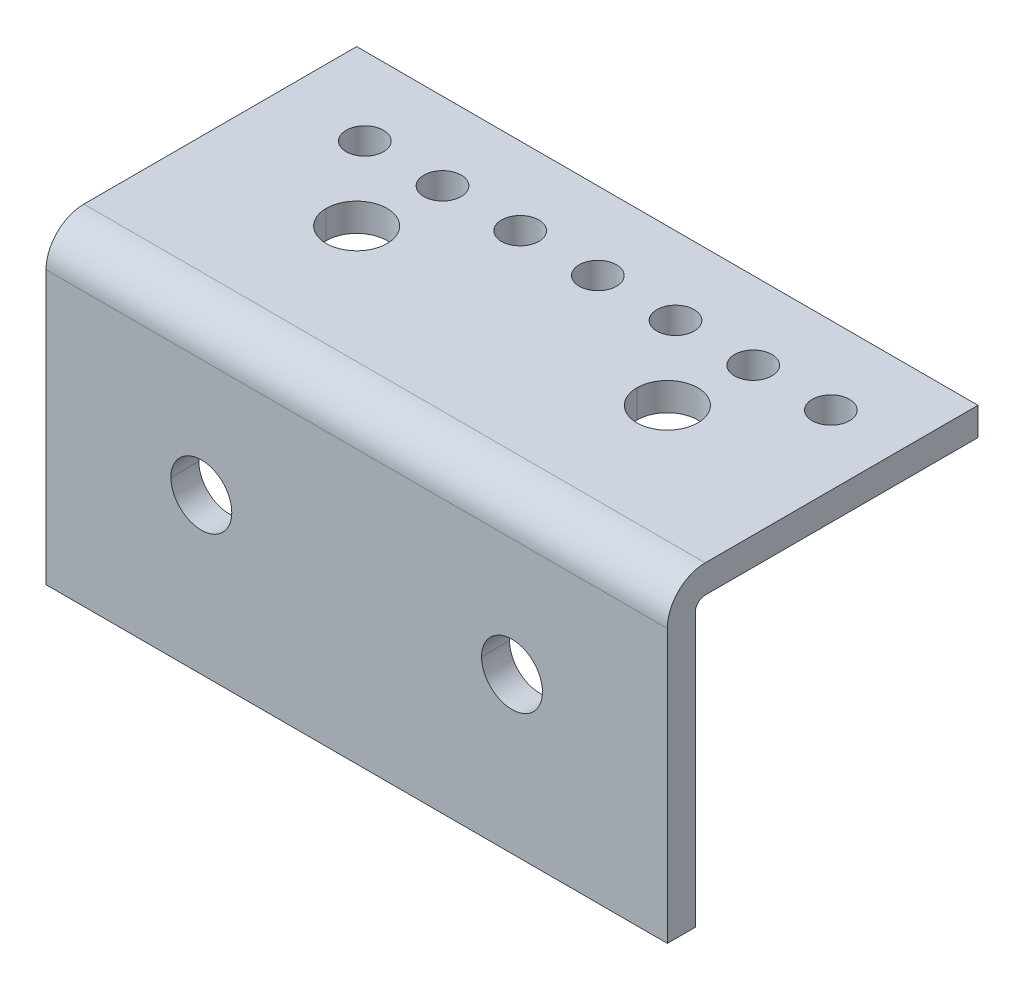
ISO-10303-21;
HEADER;
FILE_DESCRIPTION(('STEP AP214'),'2;1');
FILE_NAME('part.step','',(''),(''),'','','');
FILE_SCHEMA(('AUTOMOTIVE_DESIGN { 1 0 10303 214 1 1 1 1 }'));
ENDSEC;
DATA;
#1=APPLICATION_CONTEXT('core data for automotive mechanical design processes');
#2=APPLICATION_PROTOCOL_DEFINITION('international standard','automotive_design',2000,#1);
#3=PRODUCT_CONTEXT('',#1,'mechanical');
#4=PRODUCT('Part','Part','',(#3));
#5=PRODUCT_RELATED_PRODUCT_CATEGORY('part','',(#4));
#6=PRODUCT_DEFINITION_FORMATION('','',#4);
#7=PRODUCT_DEFINITION_CONTEXT('part definition',#1,'design');
#8=PRODUCT_DEFINITION('design','',#6,#7);
#9=PRODUCT_DEFINITION_SHAPE('','',#8);
#10=(LENGTH_UNIT() NAMED_UNIT(*) SI_UNIT(.MILLI.,.METRE.));
#11=(NAMED_UNIT(*) PLANE_ANGLE_UNIT() SI_UNIT($,.RADIAN.));
#12=(NAMED_UNIT(*) SI_UNIT($,.STERADIAN.) SOLID_ANGLE_UNIT());
#13=UNCERTAINTY_MEASURE_WITH_UNIT(LENGTH_MEASURE(1.E-05),#10,'distance_accuracy_value','');
#14=(GEOMETRIC_REPRESENTATION_CONTEXT(3) GLOBAL_UNCERTAINTY_ASSIGNED_CONTEXT((#13)) GLOBAL_UNIT_ASSIGNED_CONTEXT((#10,
#11,#12)) REPRESENTATION_CONTEXT('',''));
#15=CARTESIAN_POINT('',(0.,0.,0.));
#16=DIRECTION('',(0.,0.,1.));
#17=DIRECTION('',(1.,0.,0.));
#18=AXIS2_PLACEMENT_3D('',#15,#16,#17);
#19=CARTESIAN_POINT('',(-38.1,-25.4,25.4));
#20=DIRECTION('',(0.,0.,-1.));
#21=DIRECTION('',(1.,0.,0.));
#22=AXIS2_PLACEMENT_3D('',#19,#20,#21);
#23=CYLINDRICAL_SURFACE('',#22,2.4892);
#24=DIRECTION('',(0.,0.,-1.));
#25=VECTOR('',#24,1.);
#26=CARTESIAN_POINT('',(-40.5892,-25.4,25.4));
#27=LINE('',#26,#25);
#28=CARTESIAN_POINT('',(-40.5892,-25.4,25.4));
#29=VERTEX_POINT('',#28);
#30=CARTESIAN_POINT('',(-40.5892,-25.4,23.114));
#31=VERTEX_POINT('',#30);
#32=EDGE_CURVE('E157',#29,#31,#27,.T.);
#33=ORIENTED_EDGE('',*,*,#32,.F.);
#34=CARTESIAN_POINT('',(-38.1,-25.4,25.4));
#35=DIRECTION('',(0.,0.,-1.));
#36=DIRECTION('',(1.,0.,0.));
#37=AXIS2_PLACEMENT_3D('',#34,#35,#36);
#38=CIRCLE('',#37,2.4892);
#39=CARTESIAN_POINT('',(-35.6108,-25.4,25.4));
#40=VERTEX_POINT('',#39);
#41=EDGE_CURVE('E142',#40,#29,#38,.T.);
#42=ORIENTED_EDGE('',*,*,#41,.F.);
#43=DIRECTION('',(0.,0.,-1.));
#44=VECTOR('',#43,1.);
#45=CARTESIAN_POINT('',(-35.6108,-25.4,25.4));
#46=LINE('',#45,#44);
#47=CARTESIAN_POINT('',(-35.6108,-25.4,23.114));
#48=VERTEX_POINT('',#47);
#49=EDGE_CURVE('E165',#40,#48,#46,.T.);
#50=ORIENTED_EDGE('',*,*,#49,.T.);
#51=CARTESIAN_POINT('',(-38.1,-25.4,23.114));
#52=DIRECTION('',(0.,0.,-1.));
#53=DIRECTION('',(1.,0.,0.));
#54=AXIS2_PLACEMENT_3D('',#51,#52,#53);
#55=CIRCLE('',#54,2.4892);
#56=EDGE_CURVE('E55',#48,#31,#55,.T.);
#57=ORIENTED_EDGE('',*,*,#56,.T.);
#58=EDGE_LOOP('',(#33,#42,#50,#57));
#59=FACE_BOUND('',#58,.T.);
#60=ADVANCED_FACE('F44',(#59),#23,.F.);
#61=CARTESIAN_POINT('',(-12.7,-25.4,25.4));
#62=DIRECTION('',(0.,0.,-1.));
#63=DIRECTION('',(1.,0.,0.));
#64=AXIS2_PLACEMENT_3D('',#61,#62,#63);
#65=CYLINDRICAL_SURFACE('',#64,2.4892);
#66=DIRECTION('',(0.,0.,-1.));
#67=VECTOR('',#66,1.);
#68=CARTESIAN_POINT('',(-15.1892,-25.4,25.4));
#69=LINE('',#68,#67);
#70=CARTESIAN_POINT('',(-15.1892,-25.4,25.4));
#71=VERTEX_POINT('',#70);
#72=CARTESIAN_POINT('',(-15.1892,-25.4,23.114));
#73=VERTEX_POINT('',#72);
#74=EDGE_CURVE('E263',#71,#73,#69,.T.);
#75=ORIENTED_EDGE('',*,*,#74,.F.);
#76=CARTESIAN_POINT('',(-12.7,-25.4,25.4));
#77=DIRECTION('',(0.,0.,-1.));
#78=DIRECTION('',(1.,0.,0.));
#79=AXIS2_PLACEMENT_3D('',#76,#77,#78);
#80=CIRCLE('',#79,2.4892);
#81=CARTESIAN_POINT('',(-10.2108,-25.4,25.4));
#82=VERTEX_POINT('',#81);
#83=EDGE_CURVE('E152',#82,#71,#80,.T.);
#84=ORIENTED_EDGE('',*,*,#83,.F.);
#85=DIRECTION('',(0.,0.,-1.));
#86=VECTOR('',#85,1.);
#87=CARTESIAN_POINT('',(-10.2108,-25.4,25.4));
#88=LINE('',#87,#86);
#89=CARTESIAN_POINT('',(-10.2108,-25.4,23.114));
#90=VERTEX_POINT('',#89);
#91=EDGE_CURVE('E209',#82,#90,#88,.T.);
#92=ORIENTED_EDGE('',*,*,#91,.T.);
#93=CARTESIAN_POINT('',(-12.7,-25.4,23.114));
#94=DIRECTION('',(0.,0.,-1.));
#95=DIRECTION('',(1.,0.,0.));
#96=AXIS2_PLACEMENT_3D('',#93,#94,#95);
#97=CIRCLE('',#96,2.4892);
#98=EDGE_CURVE('E11',#90,#73,#97,.T.);
#99=ORIENTED_EDGE('',*,*,#98,.T.);
#100=EDGE_LOOP('',(#75,#84,#92,#99));
#101=FACE_BOUND('',#100,.T.);
#102=ADVANCED_FACE('F408',(#101),#65,.F.);
#103=CARTESIAN_POINT('',(-12.7,-12.7,12.7));
#104=DIRECTION('',(0.,-1.,0.));
#105=DIRECTION('',(-1.,0.,0.));
#106=AXIS2_PLACEMENT_3D('',#103,#104,#105);
#107=CYLINDRICAL_SURFACE('',#106,2.4892);
#108=DIRECTION('',(0.,-1.,0.));
#109=VECTOR('',#108,1.);
#110=CARTESIAN_POINT('',(-10.2108,-12.7,12.7));
#111=LINE('',#110,#109);
#112=CARTESIAN_POINT('',(-10.2108,-12.7,12.7));
#113=VERTEX_POINT('',#112);
#114=CARTESIAN_POINT('',(-10.2108,-14.986,12.7));
#115=VERTEX_POINT('',#114);
#116=EDGE_CURVE('E249',#113,#115,#111,.T.);
#117=ORIENTED_EDGE('',*,*,#116,.F.);
#118=CARTESIAN_POINT('',(-12.7,-12.7,12.7));
#119=DIRECTION('',(0.,-1.,0.));
#120=DIRECTION('',(-1.,0.,0.));
#121=AXIS2_PLACEMENT_3D('',#118,#119,#120);
#122=CIRCLE('',#121,2.4892);
#123=CARTESIAN_POINT('',(-15.1892,-12.7,12.7));
#124=VERTEX_POINT('',#123);
#125=EDGE_CURVE('E307',#124,#113,#122,.T.);
#126=ORIENTED_EDGE('',*,*,#125,.F.);
#127=DIRECTION('',(0.,-1.,0.));
#128=VECTOR('',#127,1.);
#129=CARTESIAN_POINT('',(-15.1892,-12.7,12.7));
#130=LINE('',#129,#128);
#131=CARTESIAN_POINT('',(-15.1892,-14.986,12.7));
#132=VERTEX_POINT('',#131);
#133=EDGE_CURVE('E219',#124,#132,#130,.T.);
#134=ORIENTED_EDGE('',*,*,#133,.T.);
#135=CARTESIAN_POINT('',(-12.7,-14.986,12.7));
#136=DIRECTION('',(0.,-1.,0.));
#137=DIRECTION('',(-1.,0.,0.));
#138=AXIS2_PLACEMENT_3D('',#135,#136,#137);
#139=CIRCLE('',#138,2.4892);
#140=EDGE_CURVE('E183',#132,#115,#139,.T.);
#141=ORIENTED_EDGE('',*,*,#140,.T.);
#142=EDGE_LOOP('',(#117,#126,#134,#141));
#143=FACE_BOUND('',#142,.T.);
#144=ADVANCED_FACE('F46',(#143),#107,.F.);
#145=CARTESIAN_POINT('',(-38.1,-12.7,12.7));
#146=DIRECTION('',(0.,-1.,0.));
#147=DIRECTION('',(-1.,0.,0.));
#148=AXIS2_PLACEMENT_3D('',#145,#146,#147);
#149=CYLINDRICAL_SURFACE('',#148,2.4892);
#150=DIRECTION('',(0.,-1.,0.));
#151=VECTOR('',#150,1.);
#152=CARTESIAN_POINT('',(-35.6108,-12.7,12.7));
#153=LINE('',#152,#151);
#154=CARTESIAN_POINT('',(-35.6108,-12.7,12.7));
#155=VERTEX_POINT('',#154);
#156=CARTESIAN_POINT('',(-35.6108,-14.986,12.7));
#157=VERTEX_POINT('',#156);
#158=EDGE_CURVE('E177',#155,#157,#153,.T.);
#159=ORIENTED_EDGE('',*,*,#158,.F.);
#160=CARTESIAN_POINT('',(-38.1,-12.7,12.7));
#161=DIRECTION('',(0.,-1.,0.));
#162=DIRECTION('',(-1.,0.,0.));
#163=AXIS2_PLACEMENT_3D('',#160,#161,#162);
#164=CIRCLE('',#163,2.4892);
#165=CARTESIAN_POINT('',(-40.5892,-12.7,12.7));
#166=VERTEX_POINT('',#165);
#167=EDGE_CURVE('E227',#166,#155,#164,.T.);
#168=ORIENTED_EDGE('',*,*,#167,.F.);
#169=DIRECTION('',(0.,-1.,0.));
#170=VECTOR('',#169,1.);
#171=CARTESIAN_POINT('',(-40.5892,-12.7,12.7));
#172=LINE('',#171,#170);
#173=CARTESIAN_POINT('',(-40.5892,-14.986,12.7));
#174=VERTEX_POINT('',#173);
#175=EDGE_CURVE('E228',#166,#174,#172,.T.);
#176=ORIENTED_EDGE('',*,*,#175,.T.);
#177=CARTESIAN_POINT('',(-38.1,-14.986,12.7));
#178=DIRECTION('',(0.,-1.,0.));
#179=DIRECTION('',(-1.,0.,0.));
#180=AXIS2_PLACEMENT_3D('',#177,#178,#179);
#181=CIRCLE('',#180,2.4892);
#182=EDGE_CURVE('E179',#174,#157,#181,.T.);
#183=ORIENTED_EDGE('',*,*,#182,.T.);
#184=EDGE_LOOP('',(#159,#168,#176,#183));
#185=FACE_BOUND('',#184,.T.);
#186=ADVANCED_FACE('F385',(#185),#149,.F.);
#187=CARTESIAN_POINT('',(-50.8,-12.7,25.400012));
#188=DIRECTION('',(1.,0.,0.));
#189=DIRECTION('',(0.,-1.,0.));
#190=AXIS2_PLACEMENT_3D('',#187,#188,#189);
#191=PLANE('',#190);
#192=CARTESIAN_POINT('',(-50.8,-15.7988,22.3012));
#193=DIRECTION('',(-1.,0.,0.));
#194=DIRECTION('',(0.,-1.,0.));
#195=AXIS2_PLACEMENT_3D('',#192,#193,#194);
#196=CIRCLE('',#195,3.0988);
#197=CARTESIAN_POINT('',(-50.8,-15.7988,25.4));
#198=VERTEX_POINT('',#197);
#199=CARTESIAN_POINT('',(-50.8,-12.7,22.3012));
#200=VERTEX_POINT('',#199);
#201=EDGE_CURVE('E48',#198,#200,#196,.T.);
#202=ORIENTED_EDGE('',*,*,#201,.T.);
#203=DIRECTION('',(0.,0.,-1.));
#204=VECTOR('',#203,1.);
#205=CARTESIAN_POINT('',(-50.8,-12.7,25.400012));
#206=LINE('',#205,#204);
#207=CARTESIAN_POINT('',(-50.8,-12.7,0.));
#208=VERTEX_POINT('',#207);
#209=EDGE_CURVE('E198',#200,#208,#206,.T.);
#210=ORIENTED_EDGE('',*,*,#209,.T.);
#211=DIRECTION('',(0.,-1.,0.));
#212=VECTOR('',#211,1.);
#213=CARTESIAN_POINT('',(-50.8,-12.7,0.));
#214=LINE('',#213,#212);
#215=CARTESIAN_POINT('',(-50.8,-14.986,0.));
#216=VERTEX_POINT('',#215);
#217=EDGE_CURVE('E226',#208,#216,#214,.T.);
#218=ORIENTED_EDGE('',*,*,#217,.T.);
#219=DIRECTION('',(0.,0.,-1.));
#220=VECTOR('',#219,1.);
#221=CARTESIAN_POINT('',(-50.8,-14.986,25.4));
#222=LINE('',#221,#220);
#223=CARTESIAN_POINT('',(-50.8,-14.986,22.3012));
#224=VERTEX_POINT('',#223);
#225=EDGE_CURVE('E238',#224,#216,#222,.T.);
#226=ORIENTED_EDGE('',*,*,#225,.F.);
#227=CARTESIAN_POINT('',(-50.8,-15.7988,22.3012));
#228=DIRECTION('',(-1.,0.,0.));
#229=DIRECTION('',(0.,-1.,0.));
#230=AXIS2_PLACEMENT_3D('',#227,#228,#229);
#231=CIRCLE('',#230,0.8128);
#232=CARTESIAN_POINT('',(-50.8,-15.7988,23.114));
#233=VERTEX_POINT('',#232);
#234=EDGE_CURVE('E245',#233,#224,#231,.T.);
#235=ORIENTED_EDGE('',*,*,#234,.F.);
#236=DIRECTION('',(0.,1.,0.));
#237=VECTOR('',#236,1.);
#238=CARTESIAN_POINT('',(-50.8,-12.7,23.114));
#239=LINE('',#238,#237);
#240=CARTESIAN_POINT('',(-50.8,-38.1,23.114));
#241=VERTEX_POINT('',#240);
#242=EDGE_CURVE('E199',#241,#233,#239,.T.);
#243=ORIENTED_EDGE('',*,*,#242,.F.);
#244=DIRECTION('',(0.,0.,-1.));
#245=VECTOR('',#244,1.);
#246=CARTESIAN_POINT('',(-50.8,-38.1,25.400012));
#247=LINE('',#246,#245);
#248=CARTESIAN_POINT('',(-50.8,-38.1,25.4));
#249=VERTEX_POINT('',#248);
#250=EDGE_CURVE('E244',#249,#241,#247,.T.);
#251=ORIENTED_EDGE('',*,*,#250,.F.);
#252=DIRECTION('',(0.,1.,0.));
#253=VECTOR('',#252,1.);
#254=CARTESIAN_POINT('',(-50.8,-12.7,25.4));
#255=LINE('',#254,#253);
#256=EDGE_CURVE('E182',#249,#198,#255,.T.);
#257=ORIENTED_EDGE('',*,*,#256,.T.);
#258=EDGE_LOOP('',(#202,#210,#218,#226,#235,#243,#251,#257));
#259=FACE_BOUND('',#258,.T.);
#260=ADVANCED_FACE('F430',(#259),#191,.F.);
#261=CARTESIAN_POINT('',(0.,-12.7,25.400012));
#262=DIRECTION('',(1.,0.,0.));
#263=DIRECTION('',(0.,-1.,0.));
#264=AXIS2_PLACEMENT_3D('',#261,#262,#263);
#265=PLANE('',#264);
#266=DIRECTION('',(0.,1.,0.));
#267=VECTOR('',#266,1.);
#268=CARTESIAN_POINT('',(0.,-12.7,25.4));
#269=LINE('',#268,#267);
#270=CARTESIAN_POINT('',(0.,-38.1,25.4));
#271=VERTEX_POINT('',#270);
#272=CARTESIAN_POINT('',(0.,-15.7988,25.4));
#273=VERTEX_POINT('',#272);
#274=EDGE_CURVE('E153',#271,#273,#269,.T.);
#275=ORIENTED_EDGE('',*,*,#274,.F.);
#276=DIRECTION('',(0.,0.,-1.));
#277=VECTOR('',#276,1.);
#278=CARTESIAN_POINT('',(0.,-38.1,25.400012));
#279=LINE('',#278,#277);
#280=CARTESIAN_POINT('',(0.,-38.1,23.114));
#281=VERTEX_POINT('',#280);
#282=EDGE_CURVE('E202',#271,#281,#279,.T.);
#283=ORIENTED_EDGE('',*,*,#282,.T.);
#284=DIRECTION('',(0.,1.,0.));
#285=VECTOR('',#284,1.);
#286=CARTESIAN_POINT('',(0.,-12.7,23.114));
#287=LINE('',#286,#285);
#288=CARTESIAN_POINT('',(0.,-15.7988,23.114));
#289=VERTEX_POINT('',#288);
#290=EDGE_CURVE('E68',#281,#289,#287,.T.);
#291=ORIENTED_EDGE('',*,*,#290,.T.);
#292=CARTESIAN_POINT('',(0.,-15.7988,22.3012));
#293=DIRECTION('',(-1.,0.,0.));
#294=DIRECTION('',(0.,-1.,0.));
#295=AXIS2_PLACEMENT_3D('',#292,#293,#294);
#296=CIRCLE('',#295,0.8128);
#297=CARTESIAN_POINT('',(0.,-14.986,22.3012));
#298=VERTEX_POINT('',#297);
#299=EDGE_CURVE('E241',#289,#298,#296,.T.);
#300=ORIENTED_EDGE('',*,*,#299,.T.);
#301=DIRECTION('',(0.,0.,-1.));
#302=VECTOR('',#301,1.);
#303=CARTESIAN_POINT('',(0.,-14.986,25.4));
#304=LINE('',#303,#302);
#305=CARTESIAN_POINT('',(0.,-14.986,0.));
#306=VERTEX_POINT('',#305);
#307=EDGE_CURVE('E207',#298,#306,#304,.T.);
#308=ORIENTED_EDGE('',*,*,#307,.T.);
#309=DIRECTION('',(0.,-1.,0.));
#310=VECTOR('',#309,1.);
#311=CARTESIAN_POINT('',(0.,-12.7,0.));
#312=LINE('',#311,#310);
#313=CARTESIAN_POINT('',(0.,-12.7,0.));
#314=VERTEX_POINT('',#313);
#315=EDGE_CURVE('E257',#314,#306,#312,.T.);
#316=ORIENTED_EDGE('',*,*,#315,.F.);
#317=DIRECTION('',(0.,0.,-1.));
#318=VECTOR('',#317,1.);
#319=CARTESIAN_POINT('',(0.,-12.7,25.400012));
#320=LINE('',#319,#318);
#321=CARTESIAN_POINT('',(0.,-12.7,22.3012));
#322=VERTEX_POINT('',#321);
#323=EDGE_CURVE('E197',#322,#314,#320,.T.);
#324=ORIENTED_EDGE('',*,*,#323,.F.);
#325=CARTESIAN_POINT('',(0.,-15.7988,22.3012));
#326=DIRECTION('',(-1.,0.,0.));
#327=DIRECTION('',(0.,-1.,0.));
#328=AXIS2_PLACEMENT_3D('',#325,#326,#327);
#329=CIRCLE('',#328,3.0988);
#330=EDGE_CURVE('E184',#273,#322,#329,.T.);
#331=ORIENTED_EDGE('',*,*,#330,.F.);
#332=EDGE_LOOP('',(#275,#283,#291,#300,#308,#316,#324,#331));
#333=FACE_BOUND('',#332,.T.);
#334=ADVANCED_FACE('F431',(#333),#265,.T.);
#335=CARTESIAN_POINT('',(-787.4,-12.7,23.114));
#336=DIRECTION('',(0.,0.,1.));
#337=DIRECTION('',(-1.,0.,0.));
#338=AXIS2_PLACEMENT_3D('',#335,#336,#337);
#339=PLANE('',#338);
#340=ORIENTED_EDGE('',*,*,#98,.F.);
#341=CARTESIAN_POINT('',(-12.7,-25.4,23.114));
#342=DIRECTION('',(0.,0.,-1.));
#343=DIRECTION('',(1.,0.,0.));
#344=AXIS2_PLACEMENT_3D('',#341,#342,#343);
#345=CIRCLE('',#344,2.4892);
#346=EDGE_CURVE('E214',#73,#90,#345,.T.);
#347=ORIENTED_EDGE('',*,*,#346,.F.);
#348=EDGE_LOOP('',(#340,#347));
#349=FACE_BOUND('',#348,.T.);
#350=ORIENTED_EDGE('',*,*,#56,.F.);
#351=CARTESIAN_POINT('',(-38.1,-25.4,23.114));
#352=DIRECTION('',(0.,0.,-1.));
#353=DIRECTION('',(1.,0.,0.));
#354=AXIS2_PLACEMENT_3D('',#351,#352,#353);
#355=CIRCLE('',#354,2.4892);
#356=EDGE_CURVE('E162',#31,#48,#355,.T.);
#357=ORIENTED_EDGE('',*,*,#356,.F.);
#358=EDGE_LOOP('',(#350,#357));
#359=FACE_BOUND('',#358,.T.);
#360=DIRECTION('',(1.,0.,0.));
#361=VECTOR('',#360,1.);
#362=CARTESIAN_POINT('',(-787.4,-38.1,23.114));
#363=LINE('',#362,#361);
#364=EDGE_CURVE('E296',#241,#281,#363,.T.);
#365=ORIENTED_EDGE('',*,*,#364,.F.);
#366=ORIENTED_EDGE('',*,*,#242,.T.);
#367=DIRECTION('',(-1.,0.,0.));
#368=VECTOR('',#367,1.);
#369=CARTESIAN_POINT('',(-787.4,-15.7988,23.114));
#370=LINE('',#369,#368);
#371=EDGE_CURVE('E248',#289,#233,#370,.T.);
#372=ORIENTED_EDGE('',*,*,#371,.F.);
#373=ORIENTED_EDGE('',*,*,#290,.F.);
#374=EDGE_LOOP('',(#365,#366,#372,#373));
#375=FACE_BOUND('',#374,.T.);
#376=ADVANCED_FACE('F418',(#349,#359,#375),#339,.F.);
#377=CARTESIAN_POINT('',(-787.4,-38.1,23.114));
#378=DIRECTION('',(0.,1.,0.));
#379=DIRECTION('',(1.,0.,0.));
#380=AXIS2_PLACEMENT_3D('',#377,#378,#379);
#381=PLANE('',#380);
#382=DIRECTION('',(1.,0.,0.));
#383=VECTOR('',#382,1.);
#384=CARTESIAN_POINT('',(-787.4,-38.1,25.4));
#385=LINE('',#384,#383);
#386=EDGE_CURVE('E192',#249,#271,#385,.T.);
#387=ORIENTED_EDGE('',*,*,#386,.F.);
#388=ORIENTED_EDGE('',*,*,#250,.T.);
#389=ORIENTED_EDGE('',*,*,#364,.T.);
#390=ORIENTED_EDGE('',*,*,#282,.F.);
#391=EDGE_LOOP('',(#387,#388,#389,#390));
#392=FACE_BOUND('',#391,.T.);
#393=ADVANCED_FACE('F415',(#392),#381,.F.);
#394=CARTESIAN_POINT('',(-787.4,-15.7988,22.3012));
#395=DIRECTION('',(1.,0.,0.));
#396=DIRECTION('',(0.,-1.,0.));
#397=AXIS2_PLACEMENT_3D('',#394,#395,#396);
#398=CYLINDRICAL_SURFACE('',#397,0.8128);
#399=ORIENTED_EDGE('',*,*,#371,.T.);
#400=ORIENTED_EDGE('',*,*,#234,.T.);
#401=DIRECTION('',(-1.,0.,0.));
#402=VECTOR('',#401,1.);
#403=CARTESIAN_POINT('',(-787.4,-14.986,22.3012));
#404=LINE('',#403,#402);
#405=EDGE_CURVE('E188',#298,#224,#404,.T.);
#406=ORIENTED_EDGE('',*,*,#405,.F.);
#407=ORIENTED_EDGE('',*,*,#299,.F.);
#408=EDGE_LOOP('',(#399,#400,#406,#407));
#409=FACE_BOUND('',#408,.T.);
#410=ADVANCED_FACE('F417',(#409),#398,.F.);
#411=CARTESIAN_POINT('',(-787.4,-12.7,25.4));
#412=DIRECTION('',(0.,0.,1.));
#413=DIRECTION('',(-1.,0.,0.));
#414=AXIS2_PLACEMENT_3D('',#411,#412,#413);
#415=PLANE('',#414);
#416=ORIENTED_EDGE('',*,*,#83,.T.);
#417=CARTESIAN_POINT('',(-12.7,-25.4,25.4));
#418=DIRECTION('',(0.,0.,-1.));
#419=DIRECTION('',(1.,0.,0.));
#420=AXIS2_PLACEMENT_3D('',#417,#418,#419);
#421=CIRCLE('',#420,2.4892);
#422=EDGE_CURVE('E266',#71,#82,#421,.T.);
#423=ORIENTED_EDGE('',*,*,#422,.T.);
#424=EDGE_LOOP('',(#416,#423));
#425=FACE_BOUND('',#424,.T.);
#426=ORIENTED_EDGE('',*,*,#41,.T.);
#427=CARTESIAN_POINT('',(-38.1,-25.4,25.4));
#428=DIRECTION('',(0.,0.,-1.));
#429=DIRECTION('',(1.,0.,0.));
#430=AXIS2_PLACEMENT_3D('',#427,#428,#429);
#431=CIRCLE('',#430,2.4892);
#432=EDGE_CURVE('E147',#29,#40,#431,.T.);
#433=ORIENTED_EDGE('',*,*,#432,.T.);
#434=EDGE_LOOP('',(#426,#433));
#435=FACE_BOUND('',#434,.T.);
#436=ORIENTED_EDGE('',*,*,#256,.F.);
#437=ORIENTED_EDGE('',*,*,#386,.T.);
#438=ORIENTED_EDGE('',*,*,#274,.T.);
#439=DIRECTION('',(-1.,0.,0.));
#440=VECTOR('',#439,1.);
#441=CARTESIAN_POINT('',(-787.4,-15.7988,25.4));
#442=LINE('',#441,#440);
#443=EDGE_CURVE('E189',#273,#198,#442,.T.);
#444=ORIENTED_EDGE('',*,*,#443,.T.);
#445=EDGE_LOOP('',(#436,#437,#438,#444));
#446=FACE_BOUND('',#445,.T.);
#447=ADVANCED_FACE('F144',(#425,#435,#446),#415,.T.);
#448=CARTESIAN_POINT('',(-787.4,-14.986,25.4));
#449=DIRECTION('',(0.,1.,0.));
#450=DIRECTION('',(1.,0.,0.));
#451=AXIS2_PLACEMENT_3D('',#448,#449,#450);
#452=PLANE('',#451);
#453=CARTESIAN_POINT('',(-5.68138413389015,-14.986,6.35));
#454=DIRECTION('',(0.,1.,0.));
#455=DIRECTION('',(0.,0.,1.));
#456=AXIS2_PLACEMENT_3D('',#453,#454,#455);
#457=CIRCLE('',#456,1.524);
#458=CARTESIAN_POINT('',(-5.68138413389015,-14.986,7.874));
#459=VERTEX_POINT('',#458);
#460=EDGE_CURVE('E167',#459,#459,#457,.T.);
#461=ORIENTED_EDGE('',*,*,#460,.T.);
#462=EDGE_LOOP('',(#461));
#463=FACE_BOUND('',#462,.T.);
#464=CARTESIAN_POINT('',(-12.0313841338901,-14.986,6.35));
#465=DIRECTION('',(0.,1.,0.));
#466=DIRECTION('',(0.,0.,1.));
#467=AXIS2_PLACEMENT_3D('',#464,#465,#466);
#468=CIRCLE('',#467,1.524);
#469=CARTESIAN_POINT('',(-12.0313841338901,-14.986,7.874));
#470=VERTEX_POINT('',#469);
#471=EDGE_CURVE('E173',#470,#470,#468,.T.);
#472=ORIENTED_EDGE('',*,*,#471,.T.);
#473=EDGE_LOOP('',(#472));
#474=FACE_BOUND('',#473,.T.);
#475=CARTESIAN_POINT('',(-43.7813841338901,-14.986,6.35000000000018));
#476=DIRECTION('',(0.,1.,0.));
#477=DIRECTION('',(0.,0.,1.));
#478=AXIS2_PLACEMENT_3D('',#475,#476,#477);
#479=CIRCLE('',#478,1.524);
#480=CARTESIAN_POINT('',(-43.7813841338901,-14.986,7.87400000000018));
#481=VERTEX_POINT('',#480);
#482=EDGE_CURVE('E495',#481,#481,#479,.T.);
#483=ORIENTED_EDGE('',*,*,#482,.T.);
#484=EDGE_LOOP('',(#483));
#485=FACE_BOUND('',#484,.T.);
#486=CARTESIAN_POINT('',(-37.4313841338901,-14.986,6.35000000000013));
#487=DIRECTION('',(0.,1.,0.));
#488=DIRECTION('',(0.,0.,1.));
#489=AXIS2_PLACEMENT_3D('',#486,#487,#488);
#490=CIRCLE('',#489,1.52400000000001);
#491=CARTESIAN_POINT('',(-37.4313841338901,-14.986,7.87400000000014));
#492=VERTEX_POINT('',#491);
#493=EDGE_CURVE('E486',#492,#492,#490,.T.);
#494=ORIENTED_EDGE('',*,*,#493,.T.);
#495=EDGE_LOOP('',(#494));
#496=FACE_BOUND('',#495,.T.);
#497=CARTESIAN_POINT('',(-31.0813841338902,-14.986,6.35000000000009));
#498=DIRECTION('',(0.,1.,0.));
#499=DIRECTION('',(0.,0.,1.));
#500=AXIS2_PLACEMENT_3D('',#497,#498,#499);
#501=CIRCLE('',#500,1.524);
#502=CARTESIAN_POINT('',(-31.0813841338902,-14.986,7.87400000000009));
#503=VERTEX_POINT('',#502);
#504=EDGE_CURVE('E482',#503,#503,#501,.T.);
#505=ORIENTED_EDGE('',*,*,#504,.T.);
#506=EDGE_LOOP('',(#505));
#507=FACE_BOUND('',#506,.T.);
#508=CARTESIAN_POINT('',(-24.7313841338902,-14.986,6.35000000000004));
#509=DIRECTION('',(0.,1.,0.));
#510=DIRECTION('',(0.,0.,1.));
#511=AXIS2_PLACEMENT_3D('',#508,#509,#510);
#512=CIRCLE('',#511,1.52400000000001);
#513=CARTESIAN_POINT('',(-24.7313841338902,-14.986,7.87400000000005));
#514=VERTEX_POINT('',#513);
#515=EDGE_CURVE('E480',#514,#514,#512,.T.);
#516=ORIENTED_EDGE('',*,*,#515,.T.);
#517=EDGE_LOOP('',(#516));
#518=FACE_BOUND('',#517,.T.);
#519=CARTESIAN_POINT('',(-18.3813841338902,-14.986,6.35));
#520=DIRECTION('',(0.,1.,0.));
#521=DIRECTION('',(0.,0.,1.));
#522=AXIS2_PLACEMENT_3D('',#519,#520,#521);
#523=CIRCLE('',#522,1.524);
#524=CARTESIAN_POINT('',(-18.3813841338902,-14.986,7.874));
#525=VERTEX_POINT('',#524);
#526=EDGE_CURVE('E483',#525,#525,#523,.T.);
#527=ORIENTED_EDGE('',*,*,#526,.T.);
#528=EDGE_LOOP('',(#527));
#529=FACE_BOUND('',#528,.T.);
#530=ORIENTED_EDGE('',*,*,#182,.F.);
#531=CARTESIAN_POINT('',(-38.1,-14.986,12.7));
#532=DIRECTION('',(0.,-1.,0.));
#533=DIRECTION('',(-1.,0.,0.));
#534=AXIS2_PLACEMENT_3D('',#531,#532,#533);
#535=CIRCLE('',#534,2.4892);
#536=EDGE_CURVE('E232',#157,#174,#535,.T.);
#537=ORIENTED_EDGE('',*,*,#536,.F.);
#538=EDGE_LOOP('',(#530,#537));
#539=FACE_BOUND('',#538,.T.);
#540=ORIENTED_EDGE('',*,*,#140,.F.);
#541=CARTESIAN_POINT('',(-12.7,-14.986,12.7));
#542=DIRECTION('',(0.,-1.,0.));
#543=DIRECTION('',(-1.,0.,0.));
#544=AXIS2_PLACEMENT_3D('',#541,#542,#543);
#545=CIRCLE('',#544,2.4892);
#546=EDGE_CURVE('E253',#115,#132,#545,.T.);
#547=ORIENTED_EDGE('',*,*,#546,.F.);
#548=EDGE_LOOP('',(#540,#547));
#549=FACE_BOUND('',#548,.T.);
#550=ORIENTED_EDGE('',*,*,#405,.T.);
#551=ORIENTED_EDGE('',*,*,#225,.T.);
#552=DIRECTION('',(-1.,0.,0.));
#553=VECTOR('',#552,1.);
#554=CARTESIAN_POINT('',(-787.4,-14.986,0.));
#555=LINE('',#554,#553);
#556=EDGE_CURVE('E222',#306,#216,#555,.T.);
#557=ORIENTED_EDGE('',*,*,#556,.F.);
#558=ORIENTED_EDGE('',*,*,#307,.F.);
#559=EDGE_LOOP('',(#550,#551,#557,#558));
#560=FACE_BOUND('',#559,.T.);
#561=ADVANCED_FACE('F421',(#463,#474,#485,#496,#507,#518,#529,#539,#549,#560),#452,.F.);
#562=CARTESIAN_POINT('',(-787.4,-15.7988,22.3012));
#563=DIRECTION('',(1.,0.,0.));
#564=DIRECTION('',(0.,-1.,0.));
#565=AXIS2_PLACEMENT_3D('',#562,#563,#564);
#566=CYLINDRICAL_SURFACE('',#565,3.0988);
#567=ORIENTED_EDGE('',*,*,#201,.F.);
#568=ORIENTED_EDGE('',*,*,#443,.F.);
#569=ORIENTED_EDGE('',*,*,#330,.T.);
#570=DIRECTION('',(-1.,0.,0.));
#571=VECTOR('',#570,1.);
#572=CARTESIAN_POINT('',(-787.4,-12.7,22.3012));
#573=LINE('',#572,#571);
#574=EDGE_CURVE('E193',#322,#200,#573,.T.);
#575=ORIENTED_EDGE('',*,*,#574,.T.);
#576=EDGE_LOOP('',(#567,#568,#569,#575));
#577=FACE_BOUND('',#576,.T.);
#578=ADVANCED_FACE('F400',(#577),#566,.T.);
#579=CARTESIAN_POINT('',(-787.4,-12.7,0.));
#580=DIRECTION('',(0.,0.,1.));
#581=DIRECTION('',(-1.,0.,0.));
#582=AXIS2_PLACEMENT_3D('',#579,#580,#581);
#583=PLANE('',#582);
#584=ORIENTED_EDGE('',*,*,#556,.T.);
#585=ORIENTED_EDGE('',*,*,#217,.F.);
#586=DIRECTION('',(-1.,0.,0.));
#587=VECTOR('',#586,1.);
#588=CARTESIAN_POINT('',(-787.4,-12.7,0.));
#589=LINE('',#588,#587);
#590=EDGE_CURVE('E314',#314,#208,#589,.T.);
#591=ORIENTED_EDGE('',*,*,#590,.F.);
#592=ORIENTED_EDGE('',*,*,#315,.T.);
#593=EDGE_LOOP('',(#584,#585,#591,#592));
#594=FACE_BOUND('',#593,.T.);
#595=ADVANCED_FACE('F393',(#594),#583,.F.);
#596=CARTESIAN_POINT('',(-787.4,-12.7,25.4));
#597=DIRECTION('',(0.,1.,0.));
#598=DIRECTION('',(1.,0.,0.));
#599=AXIS2_PLACEMENT_3D('',#596,#597,#598);
#600=PLANE('',#599);
#601=CARTESIAN_POINT('',(-5.68138413389015,-12.7,6.35));
#602=DIRECTION('',(0.,1.,0.));
#603=DIRECTION('',(0.,0.,1.));
#604=AXIS2_PLACEMENT_3D('',#601,#602,#603);
#605=CIRCLE('',#604,1.524);
#606=CARTESIAN_POINT('',(-5.68138413389015,-12.7,7.874));
#607=VERTEX_POINT('',#606);
#608=EDGE_CURVE('E735',#607,#607,#605,.T.);
#609=ORIENTED_EDGE('',*,*,#608,.F.);
#610=EDGE_LOOP('',(#609));
#611=FACE_BOUND('',#610,.T.);
#612=CARTESIAN_POINT('',(-12.0313841338901,-12.7,6.35));
#613=DIRECTION('',(0.,1.,0.));
#614=DIRECTION('',(0.,0.,1.));
#615=AXIS2_PLACEMENT_3D('',#612,#613,#614);
#616=CIRCLE('',#615,1.524);
#617=CARTESIAN_POINT('',(-12.0313841338901,-12.7,7.874));
#618=VERTEX_POINT('',#617);
#619=EDGE_CURVE('E738',#618,#618,#616,.T.);
#620=ORIENTED_EDGE('',*,*,#619,.F.);
#621=EDGE_LOOP('',(#620));
#622=FACE_BOUND('',#621,.T.);
#623=CARTESIAN_POINT('',(-43.7813841338901,-12.7,6.35000000000018));
#624=DIRECTION('',(0.,1.,0.));
#625=DIRECTION('',(0.,0.,1.));
#626=AXIS2_PLACEMENT_3D('',#623,#624,#625);
#627=CIRCLE('',#626,1.524);
#628=CARTESIAN_POINT('',(-43.7813841338901,-12.7,7.87400000000018));
#629=VERTEX_POINT('',#628);
#630=EDGE_CURVE('E741',#629,#629,#627,.T.);
#631=ORIENTED_EDGE('',*,*,#630,.F.);
#632=EDGE_LOOP('',(#631));
#633=FACE_BOUND('',#632,.T.);
#634=CARTESIAN_POINT('',(-37.4313841338901,-12.7,6.35000000000013));
#635=DIRECTION('',(0.,1.,0.));
#636=DIRECTION('',(0.,0.,1.));
#637=AXIS2_PLACEMENT_3D('',#634,#635,#636);
#638=CIRCLE('',#637,1.52400000000001);
#639=CARTESIAN_POINT('',(-37.4313841338901,-12.7,7.87400000000014));
#640=VERTEX_POINT('',#639);
#641=EDGE_CURVE('E744',#640,#640,#638,.T.);
#642=ORIENTED_EDGE('',*,*,#641,.F.);
#643=EDGE_LOOP('',(#642));
#644=FACE_BOUND('',#643,.T.);
#645=CARTESIAN_POINT('',(-31.0813841338902,-12.7,6.35000000000009));
#646=DIRECTION('',(0.,1.,0.));
#647=DIRECTION('',(0.,0.,1.));
#648=AXIS2_PLACEMENT_3D('',#645,#646,#647);
#649=CIRCLE('',#648,1.524);
#650=CARTESIAN_POINT('',(-31.0813841338902,-12.7,7.87400000000009));
#651=VERTEX_POINT('',#650);
#652=EDGE_CURVE('E747',#651,#651,#649,.T.);
#653=ORIENTED_EDGE('',*,*,#652,.F.);
#654=EDGE_LOOP('',(#653));
#655=FACE_BOUND('',#654,.T.);
#656=CARTESIAN_POINT('',(-24.7313841338902,-12.7,6.35000000000004));
#657=DIRECTION('',(0.,1.,0.));
#658=DIRECTION('',(0.,0.,1.));
#659=AXIS2_PLACEMENT_3D('',#656,#657,#658);
#660=CIRCLE('',#659,1.52400000000001);
#661=CARTESIAN_POINT('',(-24.7313841338902,-12.7,7.87400000000005));
#662=VERTEX_POINT('',#661);
#663=EDGE_CURVE('E477',#662,#662,#660,.T.);
#664=ORIENTED_EDGE('',*,*,#663,.F.);
#665=EDGE_LOOP('',(#664));
#666=FACE_BOUND('',#665,.T.);
#667=CARTESIAN_POINT('',(-18.3813841338902,-12.7,6.35));
#668=DIRECTION('',(0.,1.,0.));
#669=DIRECTION('',(0.,0.,1.));
#670=AXIS2_PLACEMENT_3D('',#667,#668,#669);
#671=CIRCLE('',#670,1.524);
#672=CARTESIAN_POINT('',(-18.3813841338902,-12.7,7.874));
#673=VERTEX_POINT('',#672);
#674=EDGE_CURVE('E489',#673,#673,#671,.T.);
#675=ORIENTED_EDGE('',*,*,#674,.F.);
#676=EDGE_LOOP('',(#675));
#677=FACE_BOUND('',#676,.T.);
#678=ORIENTED_EDGE('',*,*,#167,.T.);
#679=CARTESIAN_POINT('',(-38.1,-12.7,12.7));
#680=DIRECTION('',(0.,-1.,0.));
#681=DIRECTION('',(-1.,0.,0.));
#682=AXIS2_PLACEMENT_3D('',#679,#680,#681);
#683=CIRCLE('',#682,2.4892);
#684=EDGE_CURVE('E215',#155,#166,#683,.T.);
#685=ORIENTED_EDGE('',*,*,#684,.T.);
#686=EDGE_LOOP('',(#678,#685));
#687=FACE_BOUND('',#686,.T.);
#688=ORIENTED_EDGE('',*,*,#125,.T.);
#689=CARTESIAN_POINT('',(-12.7,-12.7,12.7));
#690=DIRECTION('',(0.,-1.,0.));
#691=DIRECTION('',(-1.,0.,0.));
#692=AXIS2_PLACEMENT_3D('',#689,#690,#691);
#693=CIRCLE('',#692,2.4892);
#694=EDGE_CURVE('E213',#113,#124,#693,.T.);
#695=ORIENTED_EDGE('',*,*,#694,.T.);
#696=EDGE_LOOP('',(#688,#695));
#697=FACE_BOUND('',#696,.T.);
#698=ORIENTED_EDGE('',*,*,#209,.F.);
#699=ORIENTED_EDGE('',*,*,#574,.F.);
#700=ORIENTED_EDGE('',*,*,#323,.T.);
#701=ORIENTED_EDGE('',*,*,#590,.T.);
#702=EDGE_LOOP('',(#698,#699,#700,#701));
#703=FACE_BOUND('',#702,.T.);
#704=ADVANCED_FACE('F340',(#611,#622,#633,#644,#655,#666,#677,#687,#697,#703),#600,.T.);
#705=CARTESIAN_POINT('',(-38.1,-12.7,12.7));
#706=DIRECTION('',(0.,-1.,0.));
#707=DIRECTION('',(-1.,0.,0.));
#708=AXIS2_PLACEMENT_3D('',#705,#706,#707);
#709=CYLINDRICAL_SURFACE('',#708,2.4892);
#710=ORIENTED_EDGE('',*,*,#684,.F.);
#711=ORIENTED_EDGE('',*,*,#158,.T.);
#712=ORIENTED_EDGE('',*,*,#536,.T.);
#713=ORIENTED_EDGE('',*,*,#175,.F.);
#714=EDGE_LOOP('',(#710,#711,#712,#713));
#715=FACE_BOUND('',#714,.T.);
#716=ADVANCED_FACE('F390',(#715),#709,.F.);
#717=CARTESIAN_POINT('',(-12.7,-12.7,12.7));
#718=DIRECTION('',(0.,-1.,0.));
#719=DIRECTION('',(-1.,0.,0.));
#720=AXIS2_PLACEMENT_3D('',#717,#718,#719);
#721=CYLINDRICAL_SURFACE('',#720,2.4892);
#722=ORIENTED_EDGE('',*,*,#694,.F.);
#723=ORIENTED_EDGE('',*,*,#116,.T.);
#724=ORIENTED_EDGE('',*,*,#546,.T.);
#725=ORIENTED_EDGE('',*,*,#133,.F.);
#726=EDGE_LOOP('',(#722,#723,#724,#725));
#727=FACE_BOUND('',#726,.T.);
#728=ADVANCED_FACE('F352',(#727),#721,.F.);
#729=CARTESIAN_POINT('',(-12.7,-25.4,25.4));
#730=DIRECTION('',(0.,0.,-1.));
#731=DIRECTION('',(1.,0.,0.));
#732=AXIS2_PLACEMENT_3D('',#729,#730,#731);
#733=CYLINDRICAL_SURFACE('',#732,2.4892);
#734=ORIENTED_EDGE('',*,*,#422,.F.);
#735=ORIENTED_EDGE('',*,*,#74,.T.);
#736=ORIENTED_EDGE('',*,*,#346,.T.);
#737=ORIENTED_EDGE('',*,*,#91,.F.);
#738=EDGE_LOOP('',(#734,#735,#736,#737));
#739=FACE_BOUND('',#738,.T.);
#740=ADVANCED_FACE('F427',(#739),#733,.F.);
#741=CARTESIAN_POINT('',(-38.1,-25.4,25.4));
#742=DIRECTION('',(0.,0.,-1.));
#743=DIRECTION('',(1.,0.,0.));
#744=AXIS2_PLACEMENT_3D('',#741,#742,#743);
#745=CYLINDRICAL_SURFACE('',#744,2.4892);
#746=ORIENTED_EDGE('',*,*,#432,.F.);
#747=ORIENTED_EDGE('',*,*,#32,.T.);
#748=ORIENTED_EDGE('',*,*,#356,.T.);
#749=ORIENTED_EDGE('',*,*,#49,.F.);
#750=EDGE_LOOP('',(#746,#747,#748,#749));
#751=FACE_BOUND('',#750,.T.);
#752=ADVANCED_FACE('F164',(#751),#745,.F.);
#753=CARTESIAN_POINT('',(-18.3813841338902,-15.24,6.35));
#754=DIRECTION('',(0.,1.,0.));
#755=DIRECTION('',(0.,0.,1.));
#756=AXIS2_PLACEMENT_3D('',#753,#754,#755);
#757=CYLINDRICAL_SURFACE('',#756,1.524);
#758=ORIENTED_EDGE('',*,*,#674,.T.);
#759=EDGE_LOOP('',(#758));
#760=FACE_BOUND('',#759,.T.);
#761=ORIENTED_EDGE('',*,*,#526,.F.);
#762=EDGE_LOOP('',(#761));
#763=FACE_BOUND('',#762,.T.);
#764=ADVANCED_FACE('F437',(#760,#763),#757,.F.);
#765=CARTESIAN_POINT('',(-24.7313841338902,-15.24,6.35000000000004));
#766=DIRECTION('',(0.,1.,0.));
#767=DIRECTION('',(0.,0.,1.));
#768=AXIS2_PLACEMENT_3D('',#765,#766,#767);
#769=CYLINDRICAL_SURFACE('',#768,1.52400000000001);
#770=ORIENTED_EDGE('',*,*,#663,.T.);
#771=EDGE_LOOP('',(#770));
#772=FACE_BOUND('',#771,.T.);
#773=ORIENTED_EDGE('',*,*,#515,.F.);
#774=EDGE_LOOP('',(#773));
#775=FACE_BOUND('',#774,.T.);
#776=ADVANCED_FACE('F448',(#772,#775),#769,.F.);
#777=CARTESIAN_POINT('',(-31.0813841338902,-15.24,6.35000000000009));
#778=DIRECTION('',(0.,1.,0.));
#779=DIRECTION('',(0.,0.,1.));
#780=AXIS2_PLACEMENT_3D('',#777,#778,#779);
#781=CYLINDRICAL_SURFACE('',#780,1.524);
#782=ORIENTED_EDGE('',*,*,#652,.T.);
#783=EDGE_LOOP('',(#782));
#784=FACE_BOUND('',#783,.T.);
#785=ORIENTED_EDGE('',*,*,#504,.F.);
#786=EDGE_LOOP('',(#785));
#787=FACE_BOUND('',#786,.T.);
#788=ADVANCED_FACE('F465',(#784,#787),#781,.F.);
#789=CARTESIAN_POINT('',(-37.4313841338901,-15.24,6.35000000000013));
#790=DIRECTION('',(0.,1.,0.));
#791=DIRECTION('',(0.,0.,1.));
#792=AXIS2_PLACEMENT_3D('',#789,#790,#791);
#793=CYLINDRICAL_SURFACE('',#792,1.52400000000001);
#794=ORIENTED_EDGE('',*,*,#641,.T.);
#795=EDGE_LOOP('',(#794));
#796=FACE_BOUND('',#795,.T.);
#797=ORIENTED_EDGE('',*,*,#493,.F.);
#798=EDGE_LOOP('',(#797));
#799=FACE_BOUND('',#798,.T.);
#800=ADVANCED_FACE('F461',(#796,#799),#793,.F.);
#801=CARTESIAN_POINT('',(-43.7813841338901,-15.24,6.35000000000018));
#802=DIRECTION('',(0.,1.,0.));
#803=DIRECTION('',(0.,0.,1.));
#804=AXIS2_PLACEMENT_3D('',#801,#802,#803);
#805=CYLINDRICAL_SURFACE('',#804,1.524);
#806=ORIENTED_EDGE('',*,*,#630,.T.);
#807=EDGE_LOOP('',(#806));
#808=FACE_BOUND('',#807,.T.);
#809=ORIENTED_EDGE('',*,*,#482,.F.);
#810=EDGE_LOOP('',(#809));
#811=FACE_BOUND('',#810,.T.);
#812=ADVANCED_FACE('F457',(#808,#811),#805,.F.);
#813=CARTESIAN_POINT('',(-12.0313841338901,-15.24,6.35));
#814=DIRECTION('',(0.,1.,0.));
#815=DIRECTION('',(0.,0.,1.));
#816=AXIS2_PLACEMENT_3D('',#813,#814,#815);
#817=CYLINDRICAL_SURFACE('',#816,1.524);
#818=ORIENTED_EDGE('',*,*,#619,.T.);
#819=EDGE_LOOP('',(#818));
#820=FACE_BOUND('',#819,.T.);
#821=ORIENTED_EDGE('',*,*,#471,.F.);
#822=EDGE_LOOP('',(#821));
#823=FACE_BOUND('',#822,.T.);
#824=ADVANCED_FACE('F453',(#820,#823),#817,.F.);
#825=CARTESIAN_POINT('',(-5.68138413389015,-15.24,6.35));
#826=DIRECTION('',(0.,1.,0.));
#827=DIRECTION('',(0.,0.,1.));
#828=AXIS2_PLACEMENT_3D('',#825,#826,#827);
#829=CYLINDRICAL_SURFACE('',#828,1.524);
#830=ORIENTED_EDGE('',*,*,#608,.T.);
#831=EDGE_LOOP('',(#830));
#832=FACE_BOUND('',#831,.T.);
#833=ORIENTED_EDGE('',*,*,#460,.F.);
#834=EDGE_LOOP('',(#833));
#835=FACE_BOUND('',#834,.T.);
#836=ADVANCED_FACE('F450',(#832,#835),#829,.F.);
#837=CLOSED_SHELL('',(#60,#102,#144,#186,#260,#334,#376,#393,#410,#447,#561,#578,#595,#704,#716,
#728,#740,#752,#764,#776,#788,#800,#812,#824,#836));
#838=MANIFOLD_SOLID_BREP('B2',#837);
#839=ADVANCED_BREP_SHAPE_REPRESENTATION('',(#18,#838),#14);
#840=SHAPE_DEFINITION_REPRESENTATION(#9,#839);
ENDSEC;
END-ISO-10303-21;
